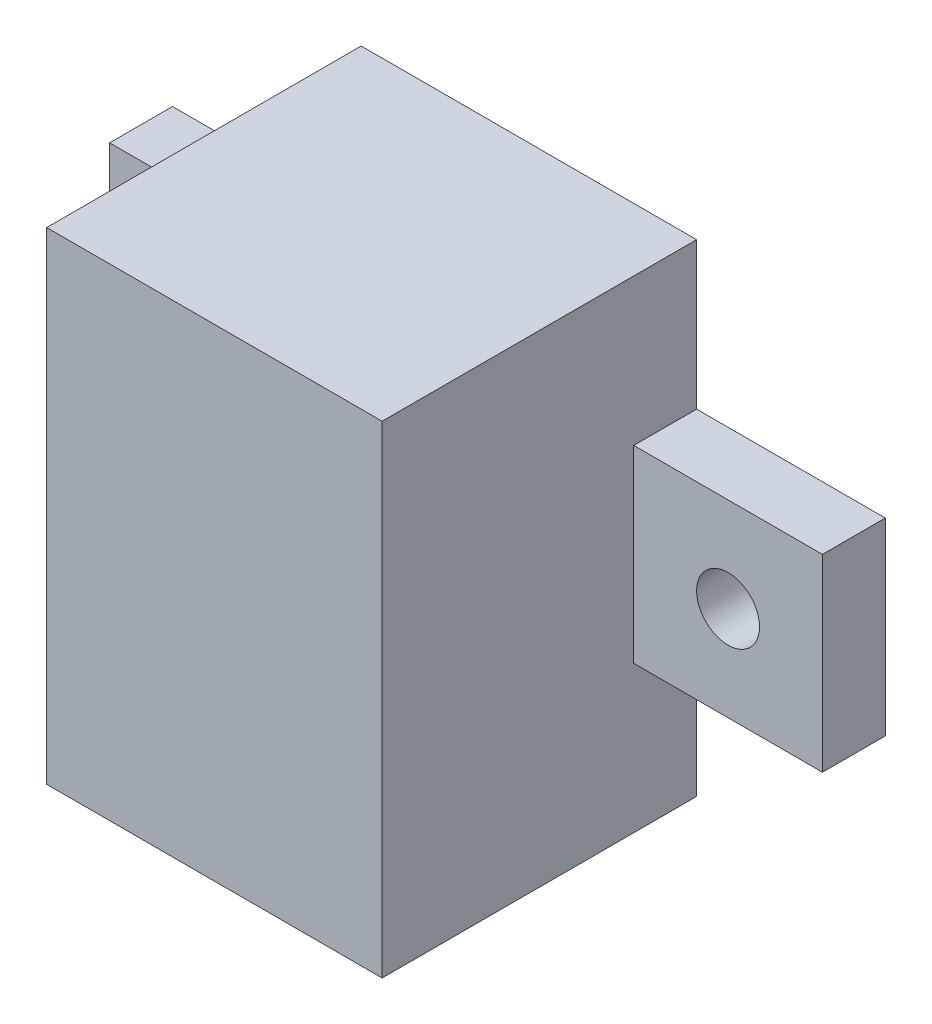
ISO-10303-21;
HEADER;
FILE_DESCRIPTION(('STEP AP214'),'2;1');
FILE_NAME('part.step','',(''),(''),'','','');
FILE_SCHEMA(('AUTOMOTIVE_DESIGN { 1 0 10303 214 1 1 1 1 }'));
ENDSEC;
DATA;
#1=APPLICATION_CONTEXT('core data for automotive mechanical design processes');
#2=APPLICATION_PROTOCOL_DEFINITION('international standard','automotive_design',2000,#1);
#3=PRODUCT_CONTEXT('',#1,'mechanical');
#4=PRODUCT('Part','Part','',(#3));
#5=PRODUCT_RELATED_PRODUCT_CATEGORY('part','',(#4));
#6=PRODUCT_DEFINITION_FORMATION('','',#4);
#7=PRODUCT_DEFINITION_CONTEXT('part definition',#1,'design');
#8=PRODUCT_DEFINITION('design','',#6,#7);
#9=PRODUCT_DEFINITION_SHAPE('','',#8);
#10=(LENGTH_UNIT() NAMED_UNIT(*) SI_UNIT(.MILLI.,.METRE.));
#11=(NAMED_UNIT(*) PLANE_ANGLE_UNIT() SI_UNIT($,.RADIAN.));
#12=(NAMED_UNIT(*) SI_UNIT($,.STERADIAN.) SOLID_ANGLE_UNIT());
#13=UNCERTAINTY_MEASURE_WITH_UNIT(LENGTH_MEASURE(1.E-05),#10,'distance_accuracy_value','');
#14=(GEOMETRIC_REPRESENTATION_CONTEXT(3) GLOBAL_UNCERTAINTY_ASSIGNED_CONTEXT((#13)) GLOBAL_UNIT_ASSIGNED_CONTEXT((#10,
#11,#12)) REPRESENTATION_CONTEXT('',''));
#15=CARTESIAN_POINT('',(0.,0.,0.));
#16=DIRECTION('',(0.,0.,1.));
#17=DIRECTION('',(1.,0.,0.));
#18=AXIS2_PLACEMENT_3D('',#15,#16,#17);
#19=CARTESIAN_POINT('',(0.,-11.5,15.));
#20=DIRECTION('',(0.,-1.,0.));
#21=DIRECTION('',(1.,0.,0.));
#22=AXIS2_PLACEMENT_3D('',#19,#20,#21);
#23=PLANE('',#22);
#24=DIRECTION('',(-1.,0.,0.));
#25=VECTOR('',#24,1.);
#26=CARTESIAN_POINT('',(0.,-11.5,2.));
#27=LINE('',#26,#25);
#28=CARTESIAN_POINT('',(5.,-11.5,2.));
#29=VERTEX_POINT('',#28);
#30=CARTESIAN_POINT('',(4.25,-11.5,2.));
#31=VERTEX_POINT('',#30);
#32=EDGE_CURVE('E230',#29,#31,#27,.T.);
#33=ORIENTED_EDGE('',*,*,#32,.T.);
#34=DIRECTION('',(0.,0.,-1.));
#35=VECTOR('',#34,1.);
#36=CARTESIAN_POINT('',(4.25,-11.5,0.));
#37=LINE('',#36,#35);
#38=CARTESIAN_POINT('',(4.25,-11.5,0.));
#39=VERTEX_POINT('',#38);
#40=EDGE_CURVE('E232',#31,#39,#37,.T.);
#41=ORIENTED_EDGE('',*,*,#40,.T.);
#42=DIRECTION('',(-1.,0.,0.));
#43=VECTOR('',#42,1.);
#44=CARTESIAN_POINT('',(0.,-11.5,0.));
#45=LINE('',#44,#43);
#46=CARTESIAN_POINT('',(8.,-11.5,0.));
#47=VERTEX_POINT('',#46);
#48=EDGE_CURVE('E287',#47,#39,#45,.T.);
#49=ORIENTED_EDGE('',*,*,#48,.F.);
#50=DIRECTION('',(0.,0.,-1.));
#51=VECTOR('',#50,1.);
#52=CARTESIAN_POINT('',(8.,-11.5,15.));
#53=LINE('',#52,#51);
#54=CARTESIAN_POINT('',(8.,-11.5,15.));
#55=VERTEX_POINT('',#54);
#56=EDGE_CURVE('E320',#55,#47,#53,.T.);
#57=ORIENTED_EDGE('',*,*,#56,.F.);
#58=DIRECTION('',(-1.,0.,0.));
#59=VECTOR('',#58,1.);
#60=CARTESIAN_POINT('',(0.,-11.5,15.));
#61=LINE('',#60,#59);
#62=CARTESIAN_POINT('',(-8.,-11.5,15.));
#63=VERTEX_POINT('',#62);
#64=EDGE_CURVE('E263',#55,#63,#61,.T.);
#65=ORIENTED_EDGE('',*,*,#64,.T.);
#66=DIRECTION('',(0.,0.,-1.));
#67=VECTOR('',#66,1.);
#68=CARTESIAN_POINT('',(-8.,-11.5,15.));
#69=LINE('',#68,#67);
#70=CARTESIAN_POINT('',(-8.,-11.5,0.));
#71=VERTEX_POINT('',#70);
#72=EDGE_CURVE('E322',#63,#71,#69,.T.);
#73=ORIENTED_EDGE('',*,*,#72,.T.);
#74=CARTESIAN_POINT('',(-4.25,-11.5,0.));
#75=VERTEX_POINT('',#74);
#76=EDGE_CURVE('E285',#75,#71,#45,.T.);
#77=ORIENTED_EDGE('',*,*,#76,.F.);
#78=DIRECTION('',(0.,0.,-1.));
#79=VECTOR('',#78,1.);
#80=CARTESIAN_POINT('',(-4.25,-11.5,0.));
#81=LINE('',#80,#79);
#82=CARTESIAN_POINT('',(-4.25,-11.5,2.));
#83=VERTEX_POINT('',#82);
#84=EDGE_CURVE('E229',#83,#75,#81,.T.);
#85=ORIENTED_EDGE('',*,*,#84,.F.);
#86=CARTESIAN_POINT('',(-5.,-11.5,2.));
#87=VERTEX_POINT('',#86);
#88=EDGE_CURVE('E226',#83,#87,#27,.T.);
#89=ORIENTED_EDGE('',*,*,#88,.T.);
#90=DIRECTION('',(0.,0.,1.));
#91=VECTOR('',#90,1.);
#92=CARTESIAN_POINT('',(-5.,-11.5,0.));
#93=LINE('',#92,#91);
#94=CARTESIAN_POINT('',(-5.,-11.5,12.));
#95=VERTEX_POINT('',#94);
#96=EDGE_CURVE('E200',#87,#95,#93,.T.);
#97=ORIENTED_EDGE('',*,*,#96,.T.);
#98=DIRECTION('',(-1.,0.,0.));
#99=VECTOR('',#98,1.);
#100=CARTESIAN_POINT('',(0.,-11.5,12.));
#101=LINE('',#100,#99);
#102=CARTESIAN_POINT('',(5.,-11.5,12.));
#103=VERTEX_POINT('',#102);
#104=EDGE_CURVE('E208',#103,#95,#101,.T.);
#105=ORIENTED_EDGE('',*,*,#104,.F.);
#106=DIRECTION('',(0.,0.,1.));
#107=VECTOR('',#106,1.);
#108=CARTESIAN_POINT('',(5.,-11.5,0.));
#109=LINE('',#108,#107);
#110=EDGE_CURVE('E211',#29,#103,#109,.T.);
#111=ORIENTED_EDGE('',*,*,#110,.F.);
#112=EDGE_LOOP('',(#33,#41,#49,#57,#65,#73,#77,#85,#89,#97,#105,#111));
#113=FACE_BOUND('',#112,.T.);
#114=ADVANCED_FACE('F38',(#113),#23,.T.);
#115=CARTESIAN_POINT('',(0.,-4.5,15.));
#116=DIRECTION('',(0.,1.,0.));
#117=DIRECTION('',(-1.,0.,0.));
#118=AXIS2_PLACEMENT_3D('',#115,#116,#117);
#119=PLANE('',#118);
#120=DIRECTION('',(1.,0.,0.));
#121=VECTOR('',#120,1.);
#122=CARTESIAN_POINT('',(0.,-4.5,3.));
#123=LINE('',#122,#121);
#124=CARTESIAN_POINT('',(8.,-4.5,3.));
#125=VERTEX_POINT('',#124);
#126=CARTESIAN_POINT('',(17.,-4.5,3.));
#127=VERTEX_POINT('',#126);
#128=EDGE_CURVE('E255',#125,#127,#123,.T.);
#129=ORIENTED_EDGE('',*,*,#128,.F.);
#130=DIRECTION('',(0.,0.,-1.));
#131=VECTOR('',#130,1.);
#132=CARTESIAN_POINT('',(8.,-4.5,15.));
#133=LINE('',#132,#131);
#134=CARTESIAN_POINT('',(8.,-4.5,0.));
#135=VERTEX_POINT('',#134);
#136=EDGE_CURVE('E318',#125,#135,#133,.T.);
#137=ORIENTED_EDGE('',*,*,#136,.T.);
#138=DIRECTION('',(1.,0.,0.));
#139=VECTOR('',#138,1.);
#140=CARTESIAN_POINT('',(0.,-4.5,0.));
#141=LINE('',#140,#139);
#142=CARTESIAN_POINT('',(17.,-4.5,0.));
#143=VERTEX_POINT('',#142);
#144=EDGE_CURVE('E293',#135,#143,#141,.T.);
#145=ORIENTED_EDGE('',*,*,#144,.T.);
#146=DIRECTION('',(0.,0.,-1.));
#147=VECTOR('',#146,1.);
#148=CARTESIAN_POINT('',(17.,-4.5,15.));
#149=LINE('',#148,#147);
#150=EDGE_CURVE('E316',#127,#143,#149,.T.);
#151=ORIENTED_EDGE('',*,*,#150,.F.);
#152=EDGE_LOOP('',(#129,#137,#145,#151));
#153=FACE_BOUND('',#152,.T.);
#154=ADVANCED_FACE('F348',(#153),#119,.F.);
#155=CARTESIAN_POINT('',(17.,0.,15.));
#156=DIRECTION('',(1.,0.,0.));
#157=DIRECTION('',(0.,0.,-1.));
#158=AXIS2_PLACEMENT_3D('',#155,#156,#157);
#159=PLANE('',#158);
#160=DIRECTION('',(0.,0.,-1.));
#161=VECTOR('',#160,1.);
#162=CARTESIAN_POINT('',(17.,4.5,15.));
#163=LINE('',#162,#161);
#164=CARTESIAN_POINT('',(17.,4.5,3.));
#165=VERTEX_POINT('',#164);
#166=CARTESIAN_POINT('',(17.,4.5,0.));
#167=VERTEX_POINT('',#166);
#168=EDGE_CURVE('E314',#165,#167,#163,.T.);
#169=ORIENTED_EDGE('',*,*,#168,.F.);
#170=DIRECTION('',(0.,-1.,0.));
#171=VECTOR('',#170,1.);
#172=CARTESIAN_POINT('',(17.,8.50000000000001,3.));
#173=LINE('',#172,#171);
#174=EDGE_CURVE('E227',#165,#127,#173,.T.);
#175=ORIENTED_EDGE('',*,*,#174,.T.);
#176=ORIENTED_EDGE('',*,*,#150,.T.);
#177=DIRECTION('',(0.,-1.,0.));
#178=VECTOR('',#177,1.);
#179=CARTESIAN_POINT('',(17.,0.,0.));
#180=LINE('',#179,#178);
#181=EDGE_CURVE('E297',#167,#143,#180,.T.);
#182=ORIENTED_EDGE('',*,*,#181,.F.);
#183=EDGE_LOOP('',(#169,#175,#176,#182));
#184=FACE_BOUND('',#183,.T.);
#185=ADVANCED_FACE('F345',(#184),#159,.T.);
#186=CARTESIAN_POINT('',(0.,4.5,15.));
#187=DIRECTION('',(0.,1.,0.));
#188=DIRECTION('',(-1.,0.,0.));
#189=AXIS2_PLACEMENT_3D('',#186,#187,#188);
#190=PLANE('',#189);
#191=DIRECTION('',(0.,0.,-1.));
#192=VECTOR('',#191,1.);
#193=CARTESIAN_POINT('',(8.,4.5,15.));
#194=LINE('',#193,#192);
#195=CARTESIAN_POINT('',(8.,4.5,3.));
#196=VERTEX_POINT('',#195);
#197=CARTESIAN_POINT('',(8.,4.5,0.));
#198=VERTEX_POINT('',#197);
#199=EDGE_CURVE('E312',#196,#198,#194,.T.);
#200=ORIENTED_EDGE('',*,*,#199,.F.);
#201=DIRECTION('',(1.,0.,0.));
#202=VECTOR('',#201,1.);
#203=CARTESIAN_POINT('',(0.,4.5,3.));
#204=LINE('',#203,#202);
#205=EDGE_CURVE('E252',#196,#165,#204,.T.);
#206=ORIENTED_EDGE('',*,*,#205,.T.);
#207=ORIENTED_EDGE('',*,*,#168,.T.);
#208=DIRECTION('',(1.,0.,0.));
#209=VECTOR('',#208,1.);
#210=CARTESIAN_POINT('',(0.,4.5,0.));
#211=LINE('',#210,#209);
#212=EDGE_CURVE('E300',#198,#167,#211,.T.);
#213=ORIENTED_EDGE('',*,*,#212,.F.);
#214=EDGE_LOOP('',(#200,#206,#207,#213));
#215=FACE_BOUND('',#214,.T.);
#216=ADVANCED_FACE('F360',(#215),#190,.T.);
#217=CARTESIAN_POINT('',(12.5,0.,15.));
#218=DIRECTION('',(0.,0.,-1.));
#219=DIRECTION('',(-1.,0.,0.));
#220=AXIS2_PLACEMENT_3D('',#217,#218,#219);
#221=CYLINDRICAL_SURFACE('',#220,1.5);
#222=CARTESIAN_POINT('',(12.5,0.,0.));
#223=DIRECTION('',(0.,0.,1.));
#224=DIRECTION('',(1.,0.,0.));
#225=AXIS2_PLACEMENT_3D('',#222,#223,#224);
#226=CIRCLE('',#225,1.5);
#227=CARTESIAN_POINT('',(14.,0.,0.));
#228=VERTEX_POINT('',#227);
#229=EDGE_CURVE('E264',#228,#228,#226,.T.);
#230=ORIENTED_EDGE('',*,*,#229,.F.);
#231=EDGE_LOOP('',(#230));
#232=FACE_BOUND('',#231,.T.);
#233=CARTESIAN_POINT('',(12.5,0.,3.));
#234=DIRECTION('',(0.,0.,1.));
#235=DIRECTION('',(1.,0.,0.));
#236=AXIS2_PLACEMENT_3D('',#233,#234,#235);
#237=CIRCLE('',#236,1.5);
#238=CARTESIAN_POINT('',(14.,0.,3.));
#239=VERTEX_POINT('',#238);
#240=EDGE_CURVE('E239',#239,#239,#237,.T.);
#241=ORIENTED_EDGE('',*,*,#240,.T.);
#242=EDGE_LOOP('',(#241));
#243=FACE_BOUND('',#242,.T.);
#244=ADVANCED_FACE('F329',(#232,#243),#221,.F.);
#245=CARTESIAN_POINT('',(0.,0.,15.));
#246=DIRECTION('',(0.,0.,1.));
#247=DIRECTION('',(1.,0.,0.));
#248=AXIS2_PLACEMENT_3D('',#245,#246,#247);
#249=PLANE('',#248);
#250=DIRECTION('',(-1.,0.,0.));
#251=VECTOR('',#250,1.);
#252=CARTESIAN_POINT('',(0.,11.5,15.));
#253=LINE('',#252,#251);
#254=CARTESIAN_POINT('',(8.,11.5,15.));
#255=VERTEX_POINT('',#254);
#256=CARTESIAN_POINT('',(-8.,11.5,15.));
#257=VERTEX_POINT('',#256);
#258=EDGE_CURVE('E270',#255,#257,#253,.T.);
#259=ORIENTED_EDGE('',*,*,#258,.T.);
#260=DIRECTION('',(0.,-1.,0.));
#261=VECTOR('',#260,1.);
#262=CARTESIAN_POINT('',(-8.,0.,15.));
#263=LINE('',#262,#261);
#264=EDGE_CURVE('E64',#257,#63,#263,.T.);
#265=ORIENTED_EDGE('',*,*,#264,.T.);
#266=ORIENTED_EDGE('',*,*,#64,.F.);
#267=DIRECTION('',(0.,-1.,0.));
#268=VECTOR('',#267,1.);
#269=CARTESIAN_POINT('',(8.,0.,15.));
#270=LINE('',#269,#268);
#271=EDGE_CURVE('E267',#255,#55,#270,.T.);
#272=ORIENTED_EDGE('',*,*,#271,.F.);
#273=EDGE_LOOP('',(#259,#265,#266,#272));
#274=FACE_BOUND('',#273,.T.);
#275=ADVANCED_FACE('F387',(#274),#249,.T.);
#276=CARTESIAN_POINT('',(0.,0.,0.));
#277=DIRECTION('',(0.,0.,1.));
#278=DIRECTION('',(1.,0.,0.));
#279=AXIS2_PLACEMENT_3D('',#276,#277,#278);
#280=PLANE('',#279);
#281=ORIENTED_EDGE('',*,*,#229,.T.);
#282=EDGE_LOOP('',(#281));
#283=FACE_BOUND('',#282,.T.);
#284=CARTESIAN_POINT('',(-12.5,0.,0.));
#285=DIRECTION('',(0.,0.,1.));
#286=DIRECTION('',(1.,0.,0.));
#287=AXIS2_PLACEMENT_3D('',#284,#285,#286);
#288=CIRCLE('',#287,1.5);
#289=CARTESIAN_POINT('',(-11.,0.,0.));
#290=VERTEX_POINT('',#289);
#291=EDGE_CURVE('E261',#290,#290,#288,.T.);
#292=ORIENTED_EDGE('',*,*,#291,.T.);
#293=EDGE_LOOP('',(#292));
#294=FACE_BOUND('',#293,.T.);
#295=DIRECTION('',(0.,-1.,0.));
#296=VECTOR('',#295,1.);
#297=CARTESIAN_POINT('',(4.25,8.5,0.));
#298=LINE('',#297,#296);
#299=CARTESIAN_POINT('',(4.25,8.5,0.));
#300=VERTEX_POINT('',#299);
#301=EDGE_CURVE('E246',#300,#39,#298,.T.);
#302=ORIENTED_EDGE('',*,*,#301,.F.);
#303=DIRECTION('',(1.,0.,0.));
#304=VECTOR('',#303,1.);
#305=CARTESIAN_POINT('',(0.,8.5,0.));
#306=LINE('',#305,#304);
#307=CARTESIAN_POINT('',(-4.25,8.5,0.));
#308=VERTEX_POINT('',#307);
#309=EDGE_CURVE('E218',#308,#300,#306,.T.);
#310=ORIENTED_EDGE('',*,*,#309,.F.);
#311=DIRECTION('',(0.,-1.,0.));
#312=VECTOR('',#311,1.);
#313=CARTESIAN_POINT('',(-4.25,8.5,0.));
#314=LINE('',#313,#312);
#315=EDGE_CURVE('E248',#308,#75,#314,.T.);
#316=ORIENTED_EDGE('',*,*,#315,.T.);
#317=ORIENTED_EDGE('',*,*,#76,.T.);
#318=DIRECTION('',(0.,-1.,0.));
#319=VECTOR('',#318,1.);
#320=CARTESIAN_POINT('',(-8.,0.,0.));
#321=LINE('',#320,#319);
#322=CARTESIAN_POINT('',(-8.,-4.5,0.));
#323=VERTEX_POINT('',#322);
#324=EDGE_CURVE('E282',#323,#71,#321,.T.);
#325=ORIENTED_EDGE('',*,*,#324,.F.);
#326=DIRECTION('',(-1.,0.,0.));
#327=VECTOR('',#326,1.);
#328=CARTESIAN_POINT('',(0.,-4.5,0.));
#329=LINE('',#328,#327);
#330=CARTESIAN_POINT('',(-17.,-4.5,0.));
#331=VERTEX_POINT('',#330);
#332=EDGE_CURVE('E279',#323,#331,#329,.T.);
#333=ORIENTED_EDGE('',*,*,#332,.T.);
#334=DIRECTION('',(0.,-1.,0.));
#335=VECTOR('',#334,1.);
#336=CARTESIAN_POINT('',(-17.,0.,0.));
#337=LINE('',#336,#335);
#338=CARTESIAN_POINT('',(-17.,4.5,0.));
#339=VERTEX_POINT('',#338);
#340=EDGE_CURVE('E276',#339,#331,#337,.T.);
#341=ORIENTED_EDGE('',*,*,#340,.F.);
#342=DIRECTION('',(-1.,0.,0.));
#343=VECTOR('',#342,1.);
#344=CARTESIAN_POINT('',(0.,4.5,0.));
#345=LINE('',#344,#343);
#346=CARTESIAN_POINT('',(-8.,4.5,0.));
#347=VERTEX_POINT('',#346);
#348=EDGE_CURVE('E274',#347,#339,#345,.T.);
#349=ORIENTED_EDGE('',*,*,#348,.F.);
#350=CARTESIAN_POINT('',(-8.,11.5,0.));
#351=VERTEX_POINT('',#350);
#352=EDGE_CURVE('E286',#351,#347,#321,.T.);
#353=ORIENTED_EDGE('',*,*,#352,.F.);
#354=DIRECTION('',(-1.,0.,0.));
#355=VECTOR('',#354,1.);
#356=CARTESIAN_POINT('',(0.,11.5,0.));
#357=LINE('',#356,#355);
#358=CARTESIAN_POINT('',(8.,11.5,0.));
#359=VERTEX_POINT('',#358);
#360=EDGE_CURVE('E303',#359,#351,#357,.T.);
#361=ORIENTED_EDGE('',*,*,#360,.F.);
#362=DIRECTION('',(0.,-1.,0.));
#363=VECTOR('',#362,1.);
#364=CARTESIAN_POINT('',(8.,0.,0.));
#365=LINE('',#364,#363);
#366=EDGE_CURVE('E294',#359,#198,#365,.T.);
#367=ORIENTED_EDGE('',*,*,#366,.T.);
#368=ORIENTED_EDGE('',*,*,#212,.T.);
#369=ORIENTED_EDGE('',*,*,#181,.T.);
#370=ORIENTED_EDGE('',*,*,#144,.F.);
#371=EDGE_CURVE('E290',#135,#47,#365,.T.);
#372=ORIENTED_EDGE('',*,*,#371,.T.);
#373=ORIENTED_EDGE('',*,*,#48,.T.);
#374=EDGE_LOOP('',(#302,#310,#316,#317,#325,#333,#341,#349,#353,#361,#367,#368,#369,#370,#372,#373));
#375=FACE_BOUND('',#374,.T.);
#376=ADVANCED_FACE('F353',(#283,#294,#375),#280,.F.);
#377=CARTESIAN_POINT('',(0.,4.5,15.));
#378=DIRECTION('',(0.,-1.,0.));
#379=DIRECTION('',(0.,0.,-1.));
#380=AXIS2_PLACEMENT_3D('',#377,#378,#379);
#381=PLANE('',#380);
#382=DIRECTION('',(0.,0.,-1.));
#383=VECTOR('',#382,1.);
#384=CARTESIAN_POINT('',(-17.,4.5,15.));
#385=LINE('',#384,#383);
#386=CARTESIAN_POINT('',(-17.,4.5,3.));
#387=VERTEX_POINT('',#386);
#388=EDGE_CURVE('E11',#387,#339,#385,.T.);
#389=ORIENTED_EDGE('',*,*,#388,.F.);
#390=DIRECTION('',(1.,0.,0.));
#391=VECTOR('',#390,1.);
#392=CARTESIAN_POINT('',(0.,4.5,3.));
#393=LINE('',#392,#391);
#394=CARTESIAN_POINT('',(-8.,4.5,3.));
#395=VERTEX_POINT('',#394);
#396=EDGE_CURVE('E259',#387,#395,#393,.T.);
#397=ORIENTED_EDGE('',*,*,#396,.T.);
#398=DIRECTION('',(0.,0.,-1.));
#399=VECTOR('',#398,1.);
#400=CARTESIAN_POINT('',(-8.,4.5,15.));
#401=LINE('',#400,#399);
#402=EDGE_CURVE('E110',#395,#347,#401,.T.);
#403=ORIENTED_EDGE('',*,*,#402,.T.);
#404=ORIENTED_EDGE('',*,*,#348,.T.);
#405=EDGE_LOOP('',(#389,#397,#403,#404));
#406=FACE_BOUND('',#405,.T.);
#407=ADVANCED_FACE('F393',(#406),#381,.F.);
#408=CARTESIAN_POINT('',(-17.,0.,15.));
#409=DIRECTION('',(1.,0.,0.));
#410=DIRECTION('',(0.,0.,-1.));
#411=AXIS2_PLACEMENT_3D('',#408,#409,#410);
#412=PLANE('',#411);
#413=DIRECTION('',(0.,0.,-1.));
#414=VECTOR('',#413,1.);
#415=CARTESIAN_POINT('',(-17.,-4.5,15.));
#416=LINE('',#415,#414);
#417=CARTESIAN_POINT('',(-17.,-4.5,3.));
#418=VERTEX_POINT('',#417);
#419=EDGE_CURVE('E47',#418,#331,#416,.T.);
#420=ORIENTED_EDGE('',*,*,#419,.F.);
#421=DIRECTION('',(0.,-1.,0.));
#422=VECTOR('',#421,1.);
#423=CARTESIAN_POINT('',(-17.,8.5,3.));
#424=LINE('',#423,#422);
#425=EDGE_CURVE('E214',#387,#418,#424,.T.);
#426=ORIENTED_EDGE('',*,*,#425,.F.);
#427=ORIENTED_EDGE('',*,*,#388,.T.);
#428=ORIENTED_EDGE('',*,*,#340,.T.);
#429=EDGE_LOOP('',(#420,#426,#427,#428));
#430=FACE_BOUND('',#429,.T.);
#431=ADVANCED_FACE('F377',(#430),#412,.F.);
#432=CARTESIAN_POINT('',(0.,-4.5,15.));
#433=DIRECTION('',(0.,-1.,0.));
#434=DIRECTION('',(0.,0.,-1.));
#435=AXIS2_PLACEMENT_3D('',#432,#433,#434);
#436=PLANE('',#435);
#437=DIRECTION('',(1.,0.,0.));
#438=VECTOR('',#437,1.);
#439=CARTESIAN_POINT('',(0.,-4.5,3.));
#440=LINE('',#439,#438);
#441=CARTESIAN_POINT('',(-8.,-4.5,3.));
#442=VERTEX_POINT('',#441);
#443=EDGE_CURVE('E257',#418,#442,#440,.T.);
#444=ORIENTED_EDGE('',*,*,#443,.F.);
#445=ORIENTED_EDGE('',*,*,#419,.T.);
#446=ORIENTED_EDGE('',*,*,#332,.F.);
#447=DIRECTION('',(0.,0.,-1.));
#448=VECTOR('',#447,1.);
#449=CARTESIAN_POINT('',(-8.,-4.5,15.));
#450=LINE('',#449,#448);
#451=EDGE_CURVE('E324',#442,#323,#450,.T.);
#452=ORIENTED_EDGE('',*,*,#451,.F.);
#453=EDGE_LOOP('',(#444,#445,#446,#452));
#454=FACE_BOUND('',#453,.T.);
#455=ADVANCED_FACE('F375',(#454),#436,.T.);
#456=CARTESIAN_POINT('',(8.,0.,15.));
#457=DIRECTION('',(1.,0.,0.));
#458=DIRECTION('',(0.,1.,0.));
#459=AXIS2_PLACEMENT_3D('',#456,#457,#458);
#460=PLANE('',#459);
#461=DIRECTION('',(0.,0.,-1.));
#462=VECTOR('',#461,1.);
#463=CARTESIAN_POINT('',(8.,11.5,15.));
#464=LINE('',#463,#462);
#465=EDGE_CURVE('E310',#255,#359,#464,.T.);
#466=ORIENTED_EDGE('',*,*,#465,.F.);
#467=ORIENTED_EDGE('',*,*,#271,.T.);
#468=ORIENTED_EDGE('',*,*,#56,.T.);
#469=ORIENTED_EDGE('',*,*,#371,.F.);
#470=ORIENTED_EDGE('',*,*,#136,.F.);
#471=DIRECTION('',(0.,-1.,0.));
#472=VECTOR('',#471,1.);
#473=CARTESIAN_POINT('',(8.,8.5,3.));
#474=LINE('',#473,#472);
#475=EDGE_CURVE('E339',#196,#125,#474,.T.);
#476=ORIENTED_EDGE('',*,*,#475,.F.);
#477=ORIENTED_EDGE('',*,*,#199,.T.);
#478=ORIENTED_EDGE('',*,*,#366,.F.);
#479=EDGE_LOOP('',(#466,#467,#468,#469,#470,#476,#477,#478));
#480=FACE_BOUND('',#479,.T.);
#481=ADVANCED_FACE('F363',(#480),#460,.T.);
#482=CARTESIAN_POINT('',(0.,11.5,15.));
#483=DIRECTION('',(0.,-1.,0.));
#484=DIRECTION('',(1.,0.,0.));
#485=AXIS2_PLACEMENT_3D('',#482,#483,#484);
#486=PLANE('',#485);
#487=ORIENTED_EDGE('',*,*,#360,.T.);
#488=DIRECTION('',(0.,0.,-1.));
#489=VECTOR('',#488,1.);
#490=CARTESIAN_POINT('',(-8.,11.5,15.));
#491=LINE('',#490,#489);
#492=EDGE_CURVE('E308',#257,#351,#491,.T.);
#493=ORIENTED_EDGE('',*,*,#492,.F.);
#494=ORIENTED_EDGE('',*,*,#258,.F.);
#495=ORIENTED_EDGE('',*,*,#465,.T.);
#496=EDGE_LOOP('',(#487,#493,#494,#495));
#497=FACE_BOUND('',#496,.T.);
#498=ADVANCED_FACE('F391',(#497),#486,.F.);
#499=CARTESIAN_POINT('',(-8.,0.,15.));
#500=DIRECTION('',(1.,0.,0.));
#501=DIRECTION('',(0.,1.,0.));
#502=AXIS2_PLACEMENT_3D('',#499,#500,#501);
#503=PLANE('',#502);
#504=ORIENTED_EDGE('',*,*,#402,.F.);
#505=DIRECTION('',(0.,-1.,0.));
#506=VECTOR('',#505,1.);
#507=CARTESIAN_POINT('',(-8.,8.5,3.));
#508=LINE('',#507,#506);
#509=EDGE_CURVE('E364',#395,#442,#508,.T.);
#510=ORIENTED_EDGE('',*,*,#509,.T.);
#511=ORIENTED_EDGE('',*,*,#451,.T.);
#512=ORIENTED_EDGE('',*,*,#324,.T.);
#513=ORIENTED_EDGE('',*,*,#72,.F.);
#514=ORIENTED_EDGE('',*,*,#264,.F.);
#515=ORIENTED_EDGE('',*,*,#492,.T.);
#516=ORIENTED_EDGE('',*,*,#352,.T.);
#517=EDGE_LOOP('',(#504,#510,#511,#512,#513,#514,#515,#516));
#518=FACE_BOUND('',#517,.T.);
#519=ADVANCED_FACE('F383',(#518),#503,.F.);
#520=CARTESIAN_POINT('',(-12.5,0.,15.));
#521=DIRECTION('',(0.,0.,-1.));
#522=DIRECTION('',(-1.,0.,0.));
#523=AXIS2_PLACEMENT_3D('',#520,#521,#522);
#524=CYLINDRICAL_SURFACE('',#523,1.5);
#525=CARTESIAN_POINT('',(-12.5,0.,3.));
#526=DIRECTION('',(0.,0.,-1.));
#527=DIRECTION('',(-1.,0.,0.));
#528=AXIS2_PLACEMENT_3D('',#525,#526,#527);
#529=CIRCLE('',#528,1.5);
#530=CARTESIAN_POINT('',(-14.,0.,3.));
#531=VERTEX_POINT('',#530);
#532=EDGE_CURVE('E42',#531,#531,#529,.T.);
#533=ORIENTED_EDGE('',*,*,#532,.F.);
#534=EDGE_LOOP('',(#533));
#535=FACE_BOUND('',#534,.T.);
#536=ORIENTED_EDGE('',*,*,#291,.F.);
#537=EDGE_LOOP('',(#536));
#538=FACE_BOUND('',#537,.T.);
#539=ADVANCED_FACE('F40',(#535,#538),#524,.F.);
#540=CARTESIAN_POINT('',(-5.,8.5,0.));
#541=DIRECTION('',(1.,0.,0.));
#542=DIRECTION('',(0.,1.,0.));
#543=AXIS2_PLACEMENT_3D('',#540,#541,#542);
#544=PLANE('',#543);
#545=ORIENTED_EDGE('',*,*,#96,.F.);
#546=DIRECTION('',(0.,-1.,0.));
#547=VECTOR('',#546,1.);
#548=CARTESIAN_POINT('',(-5.,8.5,2.));
#549=LINE('',#548,#547);
#550=CARTESIAN_POINT('',(-5.,8.5,2.));
#551=VERTEX_POINT('',#550);
#552=EDGE_CURVE('E189',#551,#87,#549,.T.);
#553=ORIENTED_EDGE('',*,*,#552,.F.);
#554=DIRECTION('',(0.,0.,1.));
#555=VECTOR('',#554,1.);
#556=CARTESIAN_POINT('',(-5.,8.5,0.));
#557=LINE('',#556,#555);
#558=CARTESIAN_POINT('',(-5.,8.5,12.));
#559=VERTEX_POINT('',#558);
#560=EDGE_CURVE('E193',#551,#559,#557,.T.);
#561=ORIENTED_EDGE('',*,*,#560,.T.);
#562=DIRECTION('',(0.,-1.,0.));
#563=VECTOR('',#562,1.);
#564=CARTESIAN_POINT('',(-5.,8.5,12.));
#565=LINE('',#564,#563);
#566=EDGE_CURVE('E237',#559,#95,#565,.T.);
#567=ORIENTED_EDGE('',*,*,#566,.T.);
#568=EDGE_LOOP('',(#545,#553,#561,#567));
#569=FACE_BOUND('',#568,.T.);
#570=ADVANCED_FACE('F197',(#569),#544,.T.);
#571=CARTESIAN_POINT('',(0.,8.5,12.));
#572=DIRECTION('',(0.,0.,1.));
#573=DIRECTION('',(1.,0.,0.));
#574=AXIS2_PLACEMENT_3D('',#571,#572,#573);
#575=PLANE('',#574);
#576=ORIENTED_EDGE('',*,*,#104,.T.);
#577=ORIENTED_EDGE('',*,*,#566,.F.);
#578=DIRECTION('',(-1.,0.,0.));
#579=VECTOR('',#578,1.);
#580=CARTESIAN_POINT('',(0.,8.5,12.));
#581=LINE('',#580,#579);
#582=CARTESIAN_POINT('',(5.,8.5,12.));
#583=VERTEX_POINT('',#582);
#584=EDGE_CURVE('E202',#583,#559,#581,.T.);
#585=ORIENTED_EDGE('',*,*,#584,.F.);
#586=DIRECTION('',(0.,-1.,0.));
#587=VECTOR('',#586,1.);
#588=CARTESIAN_POINT('',(5.,8.5,12.));
#589=LINE('',#588,#587);
#590=EDGE_CURVE('E240',#583,#103,#589,.T.);
#591=ORIENTED_EDGE('',*,*,#590,.T.);
#592=EDGE_LOOP('',(#576,#577,#585,#591));
#593=FACE_BOUND('',#592,.T.);
#594=ADVANCED_FACE('F497',(#593),#575,.F.);
#595=CARTESIAN_POINT('',(5.,8.5,0.));
#596=DIRECTION('',(1.,0.,0.));
#597=DIRECTION('',(0.,1.,0.));
#598=AXIS2_PLACEMENT_3D('',#595,#596,#597);
#599=PLANE('',#598);
#600=ORIENTED_EDGE('',*,*,#110,.T.);
#601=ORIENTED_EDGE('',*,*,#590,.F.);
#602=DIRECTION('',(0.,0.,1.));
#603=VECTOR('',#602,1.);
#604=CARTESIAN_POINT('',(5.,8.5,0.));
#605=LINE('',#604,#603);
#606=CARTESIAN_POINT('',(5.,8.5,2.));
#607=VERTEX_POINT('',#606);
#608=EDGE_CURVE('E222',#607,#583,#605,.T.);
#609=ORIENTED_EDGE('',*,*,#608,.F.);
#610=DIRECTION('',(0.,-1.,0.));
#611=VECTOR('',#610,1.);
#612=CARTESIAN_POINT('',(5.,8.5,2.));
#613=LINE('',#612,#611);
#614=EDGE_CURVE('E242',#607,#29,#613,.T.);
#615=ORIENTED_EDGE('',*,*,#614,.T.);
#616=EDGE_LOOP('',(#600,#601,#609,#615));
#617=FACE_BOUND('',#616,.T.);
#618=ADVANCED_FACE('F506',(#617),#599,.F.);
#619=CARTESIAN_POINT('',(0.,8.5,2.));
#620=DIRECTION('',(0.,0.,1.));
#621=DIRECTION('',(1.,0.,0.));
#622=AXIS2_PLACEMENT_3D('',#619,#620,#621);
#623=PLANE('',#622);
#624=ORIENTED_EDGE('',*,*,#32,.F.);
#625=ORIENTED_EDGE('',*,*,#614,.F.);
#626=DIRECTION('',(-1.,0.,0.));
#627=VECTOR('',#626,1.);
#628=CARTESIAN_POINT('',(0.,8.5,2.));
#629=LINE('',#628,#627);
#630=CARTESIAN_POINT('',(4.25,8.5,2.));
#631=VERTEX_POINT('',#630);
#632=EDGE_CURVE('E195',#607,#631,#629,.T.);
#633=ORIENTED_EDGE('',*,*,#632,.T.);
#634=DIRECTION('',(0.,-1.,0.));
#635=VECTOR('',#634,1.);
#636=CARTESIAN_POINT('',(4.25,8.5,2.));
#637=LINE('',#636,#635);
#638=EDGE_CURVE('E244',#631,#31,#637,.T.);
#639=ORIENTED_EDGE('',*,*,#638,.T.);
#640=EDGE_LOOP('',(#624,#625,#633,#639));
#641=FACE_BOUND('',#640,.T.);
#642=ADVANCED_FACE('F516',(#641),#623,.T.);
#643=CARTESIAN_POINT('',(4.25,8.5,0.));
#644=DIRECTION('',(-1.,0.,0.));
#645=DIRECTION('',(0.,0.,1.));
#646=AXIS2_PLACEMENT_3D('',#643,#644,#645);
#647=PLANE('',#646);
#648=ORIENTED_EDGE('',*,*,#40,.F.);
#649=ORIENTED_EDGE('',*,*,#638,.F.);
#650=DIRECTION('',(0.,0.,-1.));
#651=VECTOR('',#650,1.);
#652=CARTESIAN_POINT('',(4.25,8.5,0.));
#653=LINE('',#652,#651);
#654=EDGE_CURVE('E220',#631,#300,#653,.T.);
#655=ORIENTED_EDGE('',*,*,#654,.T.);
#656=ORIENTED_EDGE('',*,*,#301,.T.);
#657=EDGE_LOOP('',(#648,#649,#655,#656));
#658=FACE_BOUND('',#657,.T.);
#659=ADVANCED_FACE('F527',(#658),#647,.T.);
#660=CARTESIAN_POINT('',(-4.25,8.5,0.));
#661=DIRECTION('',(-1.,0.,0.));
#662=DIRECTION('',(0.,-1.,0.));
#663=AXIS2_PLACEMENT_3D('',#660,#661,#662);
#664=PLANE('',#663);
#665=ORIENTED_EDGE('',*,*,#84,.T.);
#666=ORIENTED_EDGE('',*,*,#315,.F.);
#667=DIRECTION('',(0.,0.,-1.));
#668=VECTOR('',#667,1.);
#669=CARTESIAN_POINT('',(-4.25,8.5,0.));
#670=LINE('',#669,#668);
#671=CARTESIAN_POINT('',(-4.25,8.5,2.));
#672=VERTEX_POINT('',#671);
#673=EDGE_CURVE('E55',#672,#308,#670,.T.);
#674=ORIENTED_EDGE('',*,*,#673,.F.);
#675=DIRECTION('',(0.,-1.,0.));
#676=VECTOR('',#675,1.);
#677=CARTESIAN_POINT('',(-4.25,8.5,2.));
#678=LINE('',#677,#676);
#679=EDGE_CURVE('E191',#672,#83,#678,.T.);
#680=ORIENTED_EDGE('',*,*,#679,.T.);
#681=EDGE_LOOP('',(#665,#666,#674,#680));
#682=FACE_BOUND('',#681,.T.);
#683=ADVANCED_FACE('F537',(#682),#664,.F.);
#684=ORIENTED_EDGE('',*,*,#88,.F.);
#685=ORIENTED_EDGE('',*,*,#679,.F.);
#686=EDGE_CURVE('E185',#672,#551,#629,.T.);
#687=ORIENTED_EDGE('',*,*,#686,.T.);
#688=ORIENTED_EDGE('',*,*,#552,.T.);
#689=EDGE_LOOP('',(#684,#685,#687,#688));
#690=FACE_BOUND('',#689,.T.);
#691=ADVANCED_FACE('F188',(#690),#623,.T.);
#692=CARTESIAN_POINT('',(0.,8.5,0.));
#693=DIRECTION('',(0.,-1.,0.));
#694=DIRECTION('',(1.,0.,0.));
#695=AXIS2_PLACEMENT_3D('',#692,#693,#694);
#696=PLANE('',#695);
#697=ORIENTED_EDGE('',*,*,#560,.F.);
#698=ORIENTED_EDGE('',*,*,#686,.F.);
#699=ORIENTED_EDGE('',*,*,#673,.T.);
#700=ORIENTED_EDGE('',*,*,#309,.T.);
#701=ORIENTED_EDGE('',*,*,#654,.F.);
#702=ORIENTED_EDGE('',*,*,#632,.F.);
#703=ORIENTED_EDGE('',*,*,#608,.T.);
#704=ORIENTED_EDGE('',*,*,#584,.T.);
#705=EDGE_LOOP('',(#697,#698,#699,#700,#701,#702,#703,#704));
#706=FACE_BOUND('',#705,.T.);
#707=ADVANCED_FACE('F205',(#706),#696,.T.);
#708=CARTESIAN_POINT('',(0.,8.5,3.));
#709=DIRECTION('',(0.,0.,1.));
#710=DIRECTION('',(1.,0.,0.));
#711=AXIS2_PLACEMENT_3D('',#708,#709,#710);
#712=PLANE('',#711);
#713=ORIENTED_EDGE('',*,*,#240,.F.);
#714=EDGE_LOOP('',(#713));
#715=FACE_BOUND('',#714,.T.);
#716=ORIENTED_EDGE('',*,*,#128,.T.);
#717=ORIENTED_EDGE('',*,*,#174,.F.);
#718=ORIENTED_EDGE('',*,*,#205,.F.);
#719=ORIENTED_EDGE('',*,*,#475,.T.);
#720=EDGE_LOOP('',(#716,#717,#718,#719));
#721=FACE_BOUND('',#720,.T.);
#722=ADVANCED_FACE('F331',(#715,#721),#712,.T.);
#723=CARTESIAN_POINT('',(0.,8.5,3.));
#724=DIRECTION('',(0.,0.,-1.));
#725=DIRECTION('',(-1.,0.,0.));
#726=AXIS2_PLACEMENT_3D('',#723,#724,#725);
#727=PLANE('',#726);
#728=ORIENTED_EDGE('',*,*,#532,.T.);
#729=EDGE_LOOP('',(#728));
#730=FACE_BOUND('',#729,.T.);
#731=ORIENTED_EDGE('',*,*,#425,.T.);
#732=ORIENTED_EDGE('',*,*,#443,.T.);
#733=ORIENTED_EDGE('',*,*,#509,.F.);
#734=ORIENTED_EDGE('',*,*,#396,.F.);
#735=EDGE_LOOP('',(#731,#732,#733,#734));
#736=FACE_BOUND('',#735,.T.);
#737=ADVANCED_FACE('F334',(#730,#736),#727,.F.);
#738=CLOSED_SHELL('',(#114,#154,#185,#216,#244,#275,#376,#407,#431,#455,#481,#498,#519,#539,
#570,#594,#618,#642,#659,#683,#691,#707,#722,#737));
#739=MANIFOLD_SOLID_BREP('B2',#738);
#740=ADVANCED_BREP_SHAPE_REPRESENTATION('',(#18,#739),#14);
#741=SHAPE_DEFINITION_REPRESENTATION(#9,#740);
ENDSEC;
END-ISO-10303-21;
